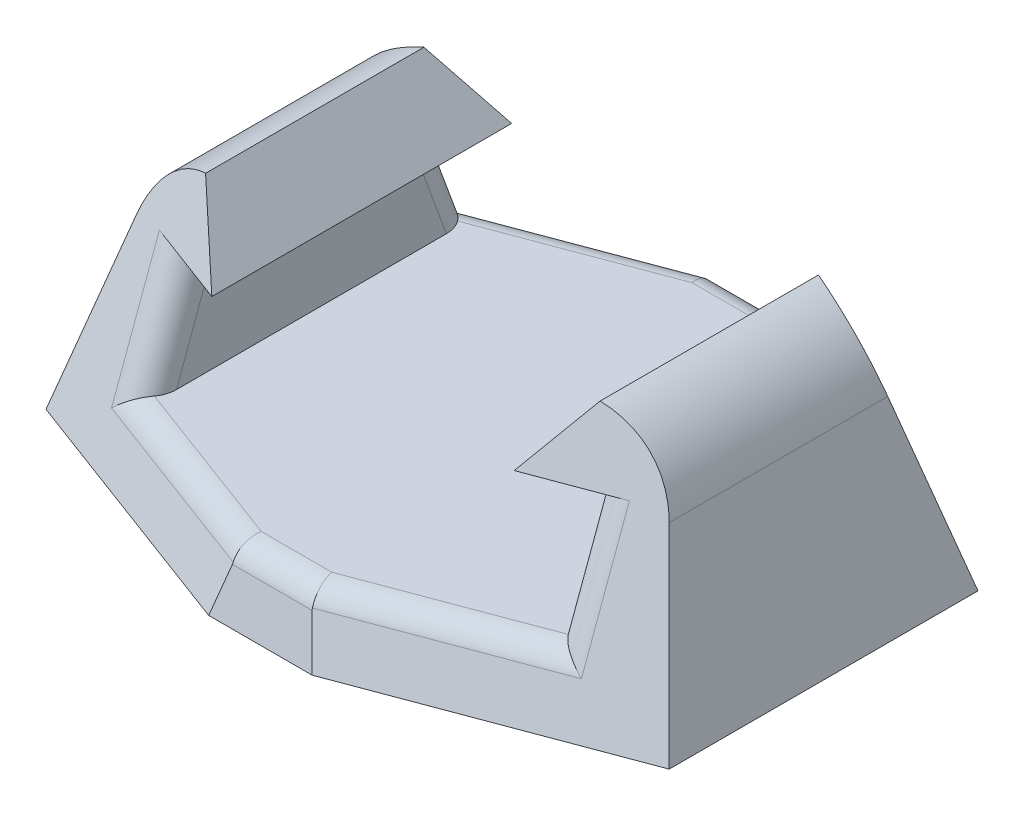
ISO-10303-21;
HEADER;
FILE_DESCRIPTION(('STEP AP214'),'2;1');
FILE_NAME('part.step','',(''),(''),'','','');
FILE_SCHEMA(('AUTOMOTIVE_DESIGN { 1 0 10303 214 1 1 1 1 }'));
ENDSEC;
DATA;
#1=APPLICATION_CONTEXT('core data for automotive mechanical design processes');
#2=APPLICATION_PROTOCOL_DEFINITION('international standard','automotive_design',2000,#1);
#3=PRODUCT_CONTEXT('',#1,'mechanical');
#4=PRODUCT('Part','Part','',(#3));
#5=PRODUCT_RELATED_PRODUCT_CATEGORY('part','',(#4));
#6=PRODUCT_DEFINITION_FORMATION('','',#4);
#7=PRODUCT_DEFINITION_CONTEXT('part definition',#1,'design');
#8=PRODUCT_DEFINITION('design','',#6,#7);
#9=PRODUCT_DEFINITION_SHAPE('','',#8);
#10=(LENGTH_UNIT() NAMED_UNIT(*) SI_UNIT(.MILLI.,.METRE.));
#11=(NAMED_UNIT(*) PLANE_ANGLE_UNIT() SI_UNIT($,.RADIAN.));
#12=(NAMED_UNIT(*) SI_UNIT($,.STERADIAN.) SOLID_ANGLE_UNIT());
#13=UNCERTAINTY_MEASURE_WITH_UNIT(LENGTH_MEASURE(1.E-05),#10,'distance_accuracy_value','');
#14=(GEOMETRIC_REPRESENTATION_CONTEXT(3) GLOBAL_UNCERTAINTY_ASSIGNED_CONTEXT((#13)) GLOBAL_UNIT_ASSIGNED_CONTEXT((#10,
#11,#12)) REPRESENTATION_CONTEXT('',''));
#15=CARTESIAN_POINT('',(0.,0.,0.));
#16=DIRECTION('',(0.,0.,1.));
#17=DIRECTION('',(1.,0.,0.));
#18=AXIS2_PLACEMENT_3D('',#15,#16,#17);
#19=CARTESIAN_POINT('',(-14.6095163514784,-3.32150879264574,20.));
#20=DIRECTION('',(0.965925826289067,-0.258819045102525,0.));
#21=DIRECTION('',(0.258819045102525,0.965925826289067,0.));
#22=AXIS2_PLACEMENT_3D('',#19,#20,#21);
#23=PLANE('',#22);
#24=DIRECTION('',(0.,0.,-1.));
#25=VECTOR('',#24,1.);
#26=CARTESIAN_POINT('',(-12.8161825284167,3.37130414995246,20.));
#27=LINE('',#26,#25);
#28=CARTESIAN_POINT('',(-12.8161825284167,3.37130414995246,14.344184387429));
#29=VERTEX_POINT('',#28);
#30=CARTESIAN_POINT('',(-12.8161825284167,3.37130414995246,5.65581561257101));
#31=VERTEX_POINT('',#30);
#32=EDGE_CURVE('E247',#29,#31,#27,.T.);
#33=ORIENTED_EDGE('',*,*,#32,.T.);
#34=DIRECTION('',(-0.250562807085736,-0.93511312653103,-0.250562807085725));
#35=VECTOR('',#34,1.);
#36=CARTESIAN_POINT('',(-13.5963751969371,0.459585471341505,4.87562294405061));
#37=LINE('',#36,#35);
#38=CARTESIAN_POINT('',(-14.6095163514784,-3.32150879264574,3.86248178950931));
#39=VERTEX_POINT('',#38);
#40=EDGE_CURVE('E292',#31,#39,#37,.T.);
#41=ORIENTED_EDGE('',*,*,#40,.T.);
#42=DIRECTION('',(0.,0.,-1.));
#43=VECTOR('',#42,1.);
#44=CARTESIAN_POINT('',(-14.6095163514784,-3.32150879264574,20.));
#45=LINE('',#44,#43);
#46=CARTESIAN_POINT('',(-14.6095163514784,-3.32150879264574,16.1375182104907));
#47=VERTEX_POINT('',#46);
#48=EDGE_CURVE('E253',#47,#39,#45,.T.);
#49=ORIENTED_EDGE('',*,*,#48,.F.);
#50=DIRECTION('',(0.250562807085736,0.93511312653103,-0.250562807085725));
#51=VECTOR('',#50,1.);
#52=CARTESIAN_POINT('',(-14.8520096028307,-4.22650592718497,16.380011461843));
#53=LINE('',#52,#51);
#54=EDGE_CURVE('E288',#47,#29,#53,.T.);
#55=ORIENTED_EDGE('',*,*,#54,.T.);
#56=EDGE_LOOP('',(#33,#41,#49,#55));
#57=FACE_BOUND('',#56,.T.);
#58=ADVANCED_FACE('F40',(#57),#23,.F.);
#59=CARTESIAN_POINT('',(10.1639913527597,-3.32150879264573,20.));
#60=DIRECTION('',(0.,1.,0.));
#61=DIRECTION('',(-1.,0.,0.));
#62=AXIS2_PLACEMENT_3D('',#59,#60,#61);
#63=PLANE('',#62);
#64=DIRECTION('',(1.,0.,0.));
#65=VECTOR('',#64,1.);
#66=CARTESIAN_POINT('',(10.1639913527597,-3.32150879264573,0.));
#67=LINE('',#66,#65);
#68=CARTESIAN_POINT('',(-4.28000862793321,-3.32150879264574,0.));
#69=VERTEX_POINT('',#68);
#70=CARTESIAN_POINT('',(-0.165516370785468,-3.32150879264574,0.));
#71=VERTEX_POINT('',#70);
#72=EDGE_CURVE('E433',#69,#71,#67,.T.);
#73=ORIENTED_EDGE('',*,*,#72,.T.);
#74=DIRECTION('',(-0.936659186885444,0.,-0.35024215569103));
#75=VECTOR('',#74,1.);
#76=CARTESIAN_POINT('',(8.29709706622276,-3.32150879264573,3.16439961776635));
#77=LINE('',#76,#75);
#78=CARTESIAN_POINT('',(10.1639913527597,-3.32150879264573,3.8624817895093));
#79=VERTEX_POINT('',#78);
#80=EDGE_CURVE('E285',#71,#79,#77,.F.);
#81=ORIENTED_EDGE('',*,*,#80,.T.);
#82=DIRECTION('',(0.,0.,-1.));
#83=VECTOR('',#82,1.);
#84=CARTESIAN_POINT('',(10.1639913527597,-3.32150879264573,20.));
#85=LINE('',#84,#83);
#86=CARTESIAN_POINT('',(10.1639913527597,-3.32150879264573,16.1375182104907));
#87=VERTEX_POINT('',#86);
#88=EDGE_CURVE('E240',#87,#79,#85,.T.);
#89=ORIENTED_EDGE('',*,*,#88,.F.);
#90=DIRECTION('',(0.936659186885443,0.,-0.35024215569103));
#91=VECTOR('',#90,1.);
#92=CARTESIAN_POINT('',(8.98678301720349,-3.32150879264573,16.577708186648));
#93=LINE('',#92,#91);
#94=CARTESIAN_POINT('',(-0.165516370785486,-3.32150879264574,20.));
#95=VERTEX_POINT('',#94);
#96=EDGE_CURVE('E276',#87,#95,#93,.F.);
#97=ORIENTED_EDGE('',*,*,#96,.T.);
#98=DIRECTION('',(1.,0.,0.));
#99=VECTOR('',#98,1.);
#100=CARTESIAN_POINT('',(10.1639913527597,-3.32150879264573,20.));
#101=LINE('',#100,#99);
#102=CARTESIAN_POINT('',(-4.2800086279332,-3.32150879264574,20.));
#103=VERTEX_POINT('',#102);
#104=EDGE_CURVE('E471',#103,#95,#101,.T.);
#105=ORIENTED_EDGE('',*,*,#104,.F.);
#106=DIRECTION('',(0.936659186885444,0.,0.35024215569103));
#107=VECTOR('',#106,1.);
#108=CARTESIAN_POINT('',(-14.7427113227856,-3.32150879264574,16.0877130150354));
#109=LINE('',#108,#107);
#110=EDGE_CURVE('E279',#103,#47,#109,.F.);
#111=ORIENTED_EDGE('',*,*,#110,.T.);
#112=ORIENTED_EDGE('',*,*,#48,.T.);
#113=DIRECTION('',(-0.936659186885444,0.,0.35024215569103));
#114=VECTOR('',#113,1.);
#115=CARTESIAN_POINT('',(-14.0530253718049,-3.32150879264574,3.65439478937901));
#116=LINE('',#115,#114);
#117=EDGE_CURVE('E282',#39,#69,#116,.F.);
#118=ORIENTED_EDGE('',*,*,#117,.T.);
#119=EDGE_LOOP('',(#73,#81,#89,#97,#105,#111,#112,#118));
#120=FACE_BOUND('',#119,.T.);
#121=ADVANCED_FACE('F517',(#120),#63,.F.);
#122=CARTESIAN_POINT('',(7.61847402466403,6.17849120735427,20.));
#123=DIRECTION('',(-0.965925826289067,-0.258819045102525,0.));
#124=DIRECTION('',(0.258819045102525,-0.965925826289067,0.));
#125=AXIS2_PLACEMENT_3D('',#122,#123,#124);
#126=PLANE('',#125);
#127=ORIENTED_EDGE('',*,*,#88,.T.);
#128=DIRECTION('',(-0.250562807085736,0.93511312653103,0.250562807085725));
#129=VECTOR('',#128,1.);
#130=CARTESIAN_POINT('',(6.76514482702044,9.36315912854207,7.26132831524845));
#131=LINE('',#130,#129);
#132=CARTESIAN_POINT('',(8.37065752969796,3.37130414995246,5.65581561257101));
#133=VERTEX_POINT('',#132);
#134=EDGE_CURVE('E221',#79,#133,#131,.T.);
#135=ORIENTED_EDGE('',*,*,#134,.T.);
#136=DIRECTION('',(0.,0.,1.));
#137=VECTOR('',#136,1.);
#138=CARTESIAN_POINT('',(8.37065752969796,3.37130414995246,20.));
#139=LINE('',#138,#137);
#140=CARTESIAN_POINT('',(8.37065752969796,3.37130414995246,14.344184387429));
#141=VERTEX_POINT('',#140);
#142=EDGE_CURVE('E237',#133,#141,#139,.T.);
#143=ORIENTED_EDGE('',*,*,#142,.T.);
#144=DIRECTION('',(0.250562807085736,-0.93511312653103,0.250562807085725));
#145=VECTOR('',#144,1.);
#146=CARTESIAN_POINT('',(8.02077923291406,4.67706773001559,13.9943060906451));
#147=LINE('',#146,#145);
#148=EDGE_CURVE('E242',#141,#87,#147,.T.);
#149=ORIENTED_EDGE('',*,*,#148,.T.);
#150=EDGE_LOOP('',(#127,#135,#143,#149));
#151=FACE_BOUND('',#150,.T.);
#152=ADVANCED_FACE('F235',(#151),#126,.F.);
#153=CARTESIAN_POINT('',(3.80446284792144,3.67849120735427,20.));
#154=DIRECTION('',(0.809377883181939,-0.587288210520119,0.));
#155=DIRECTION('',(0.587288210520119,0.809377883181939,0.));
#156=AXIS2_PLACEMENT_3D('',#153,#154,#155);
#157=PLANE('',#156);
#158=DIRECTION('',(0.,0.,-1.));
#159=VECTOR('',#158,1.);
#160=CARTESIAN_POINT('',(5.61847402466403,6.17849120735427,20.));
#161=LINE('',#160,#159);
#162=CARTESIAN_POINT('',(5.61847402466403,6.17849120735427,14.3398548736758));
#163=VERTEX_POINT('',#162);
#164=CARTESIAN_POINT('',(5.61847402466403,6.17849120735427,5.66014512632415));
#165=VERTEX_POINT('',#164);
#166=EDGE_CURVE('E508',#163,#165,#161,.T.);
#167=ORIENTED_EDGE('',*,*,#166,.T.);
#168=DIRECTION('',(0.521569914406186,0.718807470832079,0.459652743124974));
#169=VECTOR('',#168,1.);
#170=CARTESIAN_POINT('',(7.50823674265189,8.78288904984896,7.32556829047921));
#171=LINE('',#170,#169);
#172=CARTESIAN_POINT('',(3.80446284792144,3.67849120735427,4.06148080459386));
#173=VERTEX_POINT('',#172);
#174=EDGE_CURVE('E223',#165,#173,#171,.F.);
#175=ORIENTED_EDGE('',*,*,#174,.T.);
#176=DIRECTION('',(0.,0.,-1.));
#177=VECTOR('',#176,1.);
#178=CARTESIAN_POINT('',(3.80446284792144,3.67849120735427,20.));
#179=LINE('',#178,#177);
#180=CARTESIAN_POINT('',(3.80446284792144,3.67849120735427,15.9385191954061));
#181=VERTEX_POINT('',#180);
#182=EDGE_CURVE('E498',#181,#173,#179,.T.);
#183=ORIENTED_EDGE('',*,*,#182,.F.);
#184=DIRECTION('',(-0.521569914406186,-0.718807470832079,0.459652743124974));
#185=VECTOR('',#184,1.);
#186=CARTESIAN_POINT('',(5.79193156903858,6.41754368205571,14.1869890087452));
#187=LINE('',#186,#185);
#188=EDGE_CURVE('E229',#181,#163,#187,.F.);
#189=ORIENTED_EDGE('',*,*,#188,.T.);
#190=EDGE_LOOP('',(#167,#175,#183,#189));
#191=FACE_BOUND('',#190,.T.);
#192=ADVANCED_FACE('F588',(#191),#157,.F.);
#193=CARTESIAN_POINT('',(5.80446284792144,3.67849120735427,20.));
#194=DIRECTION('',(0.,1.,0.));
#195=DIRECTION('',(0.,0.,1.));
#196=AXIS2_PLACEMENT_3D('',#193,#194,#195);
#197=PLANE('',#196);
#198=ORIENTED_EDGE('',*,*,#182,.T.);
#199=DIRECTION('',(-0.936659186885444,0.,-0.35024215569103));
#200=VECTOR('',#199,1.);
#201=CARTESIAN_POINT('',(7.45169332833665,3.67849120735427,5.42527874054352));
#202=LINE('',#201,#200);
#203=CARTESIAN_POINT('',(7.13557266697512,3.67849120735427,5.30707269138075));
#204=VERTEX_POINT('',#203);
#205=EDGE_CURVE('E266',#173,#204,#202,.F.);
#206=ORIENTED_EDGE('',*,*,#205,.T.);
#207=CARTESIAN_POINT('',(6.80446284792144,3.67849120735427,6.31257591668668));
#208=DIRECTION('',(0.,1.,0.));
#209=DIRECTION('',(0.,0.,-1.));
#210=AXIS2_PLACEMENT_3D('',#207,#208,#209);
#211=ELLIPSE('',#210,1.06561202848115,1.);
#212=CARTESIAN_POINT('',(5.80446284792144,3.67849120735427,6.31257591668669));
#213=VERTEX_POINT('',#212);
#214=EDGE_CURVE('E405',#204,#213,#211,.T.);
#215=ORIENTED_EDGE('',*,*,#214,.T.);
#216=DIRECTION('',(0.,0.,-1.));
#217=VECTOR('',#216,1.);
#218=CARTESIAN_POINT('',(5.80446284792144,3.67849120735427,20.));
#219=LINE('',#218,#217);
#220=CARTESIAN_POINT('',(5.80446284792144,3.67849120735427,13.6874240833133));
#221=VERTEX_POINT('',#220);
#222=EDGE_CURVE('E493',#221,#213,#219,.T.);
#223=ORIENTED_EDGE('',*,*,#222,.F.);
#224=CARTESIAN_POINT('',(6.80446284792144,3.67849120735427,13.6874240833133));
#225=DIRECTION('',(0.,1.,0.));
#226=DIRECTION('',(0.,0.,-1.));
#227=AXIS2_PLACEMENT_3D('',#224,#225,#226);
#228=ELLIPSE('',#227,1.06561202848115,1.);
#229=CARTESIAN_POINT('',(7.13557266697512,3.67849120735427,14.6929273086192));
#230=VERTEX_POINT('',#229);
#231=EDGE_CURVE('E408',#221,#230,#228,.T.);
#232=ORIENTED_EDGE('',*,*,#231,.T.);
#233=DIRECTION('',(0.936659186885443,0.,-0.35024215569103));
#234=VECTOR('',#233,1.);
#235=CARTESIAN_POINT('',(8.14137927931738,3.67849120735427,14.3168290638709));
#236=LINE('',#235,#234);
#237=EDGE_CURVE('E263',#230,#181,#236,.F.);
#238=ORIENTED_EDGE('',*,*,#237,.T.);
#239=EDGE_LOOP('',(#198,#206,#215,#223,#232,#238));
#240=FACE_BOUND('',#239,.T.);
#241=ADVANCED_FACE('F584',(#240),#197,.F.);
#242=CARTESIAN_POINT('',(5.80446284792144,-0.821508792645734,20.));
#243=DIRECTION('',(1.,0.,0.));
#244=DIRECTION('',(0.,0.,-1.));
#245=AXIS2_PLACEMENT_3D('',#242,#243,#244);
#246=PLANE('',#245);
#247=ORIENTED_EDGE('',*,*,#222,.T.);
#248=DIRECTION('',(0.,0.938427845475182,0.345475294104814));
#249=VECTOR('',#248,1.);
#250=CARTESIAN_POINT('',(5.80446284792144,-1.30886502966497,4.47651748012437));
#251=LINE('',#250,#249);
#252=CARTESIAN_POINT('',(5.80446284792144,-0.821508792645734,4.6559340864515));
#253=VERTEX_POINT('',#252);
#254=EDGE_CURVE('E341',#213,#253,#251,.F.);
#255=ORIENTED_EDGE('',*,*,#254,.T.);
#256=DIRECTION('',(0.,0.,-1.));
#257=VECTOR('',#256,1.);
#258=CARTESIAN_POINT('',(5.80446284792144,-0.821508792645734,20.));
#259=LINE('',#258,#257);
#260=CARTESIAN_POINT('',(5.80446284792144,-0.821508792645734,15.3440659135485));
#261=VERTEX_POINT('',#260);
#262=EDGE_CURVE('E485',#261,#253,#259,.T.);
#263=ORIENTED_EDGE('',*,*,#262,.F.);
#264=DIRECTION('',(0.,-0.938427845475182,0.345475294104814));
#265=VECTOR('',#264,1.);
#266=CARTESIAN_POINT('',(5.80446284792144,3.19113497033503,13.8668406896404));
#267=LINE('',#266,#265);
#268=EDGE_CURVE('E337',#261,#221,#267,.F.);
#269=ORIENTED_EDGE('',*,*,#268,.T.);
#270=EDGE_LOOP('',(#247,#255,#263,#269));
#271=FACE_BOUND('',#270,.T.);
#272=ADVANCED_FACE('F489',(#271),#246,.F.);
#273=CARTESIAN_POINT('',(-10.1955371520786,-0.821508792645734,20.));
#274=DIRECTION('',(0.,-1.,0.));
#275=DIRECTION('',(0.,0.,-1.));
#276=AXIS2_PLACEMENT_3D('',#273,#274,#275);
#277=PLANE('',#276);
#278=CARTESIAN_POINT('',(-11.1955371520786,-0.821508792645734,15.3644264981764));
#279=DIRECTION('',(0.,-1.,0.));
#280=DIRECTION('',(0.,0.,1.));
#281=AXIS2_PLACEMENT_3D('',#278,#279,#280);
#282=ELLIPSE('',#281,1.06561202848115,1.);
#283=CARTESIAN_POINT('',(-10.1955371520786,-0.821508792645734,15.3644264981764));
#284=VERTEX_POINT('',#283);
#285=CARTESIAN_POINT('',(-10.4114273809065,-0.821508792645734,16.0257689381042));
#286=VERTEX_POINT('',#285);
#287=EDGE_CURVE('E50',#284,#286,#282,.T.);
#288=ORIENTED_EDGE('',*,*,#287,.T.);
#289=DIRECTION('',(-0.936659186885444,0.,-0.35024215569103));
#290=VECTOR('',#289,1.);
#291=CARTESIAN_POINT('',(-3.36042760379279,-0.821508792645734,18.6623281010213));
#292=LINE('',#291,#290);
#293=CARTESIAN_POINT('',(-3.62659739425575,-0.821508792645734,18.5628000309432));
#294=VERTEX_POINT('',#293);
#295=EDGE_CURVE('E58',#286,#294,#292,.F.);
#296=ORIENTED_EDGE('',*,*,#295,.T.);
#297=DIRECTION('',(1.,0.,0.));
#298=VECTOR('',#297,1.);
#299=CARTESIAN_POINT('',(-10.1955371520786,-0.821508792645734,18.5628000309432));
#300=LINE('',#299,#298);
#301=CARTESIAN_POINT('',(-0.818927604462946,-0.821508792645734,18.5628000309432));
#302=VERTEX_POINT('',#301);
#303=EDGE_CURVE('E383',#294,#302,#300,.T.);
#304=ORIENTED_EDGE('',*,*,#303,.T.);
#305=DIRECTION('',(-0.936659186885443,0.,0.35024215569103));
#306=VECTOR('',#305,1.);
#307=CARTESIAN_POINT('',(5.55475480485885,-0.821508792645734,16.1795081164596));
#308=LINE('',#307,#306);
#309=CARTESIAN_POINT('',(6.02035307674938,-0.821508792645734,16.0054083534763));
#310=VERTEX_POINT('',#309);
#311=EDGE_CURVE('E66',#302,#310,#308,.F.);
#312=ORIENTED_EDGE('',*,*,#311,.T.);
#313=CARTESIAN_POINT('',(6.80446284792144,-0.821508792645734,15.3440659135485));
#314=DIRECTION('',(0.,-1.,0.));
#315=DIRECTION('',(0.,0.,-1.));
#316=AXIS2_PLACEMENT_3D('',#313,#314,#315);
#317=ELLIPSE('',#316,1.06561202848115,1.);
#318=EDGE_CURVE('E412',#310,#261,#317,.T.);
#319=ORIENTED_EDGE('',*,*,#318,.T.);
#320=ORIENTED_EDGE('',*,*,#262,.T.);
#321=CARTESIAN_POINT('',(6.80446284792144,-0.821508792645734,4.6559340864515));
#322=DIRECTION('',(0.,-1.,0.));
#323=DIRECTION('',(0.,0.,-1.));
#324=AXIS2_PLACEMENT_3D('',#321,#322,#323);
#325=ELLIPSE('',#324,1.06561202848115,1.);
#326=CARTESIAN_POINT('',(6.02035307674938,-0.821508792645734,3.99459164652372));
#327=VERTEX_POINT('',#326);
#328=EDGE_CURVE('E401',#253,#327,#325,.T.);
#329=ORIENTED_EDGE('',*,*,#328,.T.);
#330=DIRECTION('',(0.936659186885444,0.,0.35024215569103));
#331=VECTOR('',#330,1.);
#332=CARTESIAN_POINT('',(-1.08509739492588,-0.821508792645734,1.33767189897871));
#333=LINE('',#332,#331);
#334=CARTESIAN_POINT('',(-0.818927604462917,-0.821508792645734,1.43719996905676));
#335=VERTEX_POINT('',#334);
#336=EDGE_CURVE('E372',#327,#335,#333,.F.);
#337=ORIENTED_EDGE('',*,*,#336,.T.);
#338=DIRECTION('',(-1.,0.,0.));
#339=VECTOR('',#338,1.);
#340=CARTESIAN_POINT('',(-10.1955371520786,-0.821508792645734,1.43719996905676));
#341=LINE('',#340,#339);
#342=CARTESIAN_POINT('',(-3.62659739425576,-0.821508792645734,1.43719996905676));
#343=VERTEX_POINT('',#342);
#344=EDGE_CURVE('E375',#335,#343,#341,.T.);
#345=ORIENTED_EDGE('',*,*,#344,.T.);
#346=DIRECTION('',(0.936659186885444,0.,-0.35024215569103));
#347=VECTOR('',#346,1.);
#348=CARTESIAN_POINT('',(-9.94582910901598,-0.821508792645734,3.80013129891241));
#349=LINE('',#348,#347);
#350=CARTESIAN_POINT('',(-10.4114273809065,-0.821508792645734,3.97423106189579));
#351=VERTEX_POINT('',#350);
#352=EDGE_CURVE('E378',#343,#351,#349,.F.);
#353=ORIENTED_EDGE('',*,*,#352,.T.);
#354=CARTESIAN_POINT('',(-11.1955371520786,-0.821508792645734,4.63557350182357));
#355=DIRECTION('',(0.,-1.,0.));
#356=DIRECTION('',(0.,0.,1.));
#357=AXIS2_PLACEMENT_3D('',#354,#355,#356);
#358=ELLIPSE('',#357,1.06561202848115,1.);
#359=CARTESIAN_POINT('',(-10.1955371520786,-0.821508792645734,4.63557350182357));
#360=VERTEX_POINT('',#359);
#361=EDGE_CURVE('E398',#351,#360,#358,.T.);
#362=ORIENTED_EDGE('',*,*,#361,.T.);
#363=DIRECTION('',(0.,0.,-1.));
#364=VECTOR('',#363,1.);
#365=CARTESIAN_POINT('',(-10.1955371520786,-0.821508792645734,20.));
#366=LINE('',#365,#364);
#367=EDGE_CURVE('E494',#284,#360,#366,.T.);
#368=ORIENTED_EDGE('',*,*,#367,.F.);
#369=EDGE_LOOP('',(#288,#296,#304,#312,#319,#320,#329,#337,#345,#353,#362,#368));
#370=FACE_BOUND('',#369,.T.);
#371=ADVANCED_FACE('F484',(#370),#277,.F.);
#372=CARTESIAN_POINT('',(-10.1955371520786,3.67849120735427,20.));
#373=DIRECTION('',(-1.,0.,0.));
#374=DIRECTION('',(0.,-1.,0.));
#375=AXIS2_PLACEMENT_3D('',#372,#373,#374);
#376=PLANE('',#375);
#377=ORIENTED_EDGE('',*,*,#367,.T.);
#378=DIRECTION('',(0.,-0.938427845475182,-0.345475294104814));
#379=VECTOR('',#378,1.);
#380=CARTESIAN_POINT('',(-10.1955371520786,3.19113497033503,6.11279872573163));
#381=LINE('',#380,#379);
#382=CARTESIAN_POINT('',(-10.1955371520786,3.67849120735427,6.29221533205876));
#383=VERTEX_POINT('',#382);
#384=EDGE_CURVE('E324',#360,#383,#381,.F.);
#385=ORIENTED_EDGE('',*,*,#384,.T.);
#386=DIRECTION('',(0.,0.,-1.));
#387=VECTOR('',#386,1.);
#388=CARTESIAN_POINT('',(-10.1955371520786,3.67849120735427,20.));
#389=LINE('',#388,#387);
#390=CARTESIAN_POINT('',(-10.1955371520786,3.67849120735427,13.7077846679412));
#391=VERTEX_POINT('',#390);
#392=EDGE_CURVE('E501',#391,#383,#389,.T.);
#393=ORIENTED_EDGE('',*,*,#392,.F.);
#394=DIRECTION('',(0.,0.938427845475182,-0.345475294104814));
#395=VECTOR('',#394,1.);
#396=CARTESIAN_POINT('',(-10.1955371520786,-1.30886502966497,15.5438431045036));
#397=LINE('',#396,#395);
#398=EDGE_CURVE('E321',#391,#284,#397,.F.);
#399=ORIENTED_EDGE('',*,*,#398,.T.);
#400=EDGE_LOOP('',(#377,#385,#393,#399));
#401=FACE_BOUND('',#400,.T.);
#402=ADVANCED_FACE('F549',(#401),#376,.F.);
#403=CARTESIAN_POINT('',(-8.19553715207856,3.67849120735427,20.));
#404=DIRECTION('',(0.,1.,0.));
#405=DIRECTION('',(-1.,0.,0.));
#406=AXIS2_PLACEMENT_3D('',#403,#404,#405);
#407=PLANE('',#406);
#408=DIRECTION('',(0.936659186885444,0.,0.35024215569103));
#409=VECTOR('',#408,1.);
#410=CARTESIAN_POINT('',(-13.8973075848995,3.67849120735426,13.8268338922582));
#411=LINE('',#410,#409);
#412=CARTESIAN_POINT('',(-8.19553715207856,3.67849120735427,15.9588797800341));
#413=VERTEX_POINT('',#412);
#414=CARTESIAN_POINT('',(-11.5266469711322,3.67849120735426,14.7132878932472));
#415=VERTEX_POINT('',#414);
#416=EDGE_CURVE('E296',#413,#415,#411,.F.);
#417=ORIENTED_EDGE('',*,*,#416,.T.);
#418=CARTESIAN_POINT('',(-11.1955371520786,3.67849120735427,13.7077846679412));
#419=DIRECTION('',(0.,1.,0.));
#420=DIRECTION('',(0.,0.,1.));
#421=AXIS2_PLACEMENT_3D('',#418,#419,#420);
#422=ELLIPSE('',#421,1.06561202848115,1.);
#423=EDGE_CURVE('E11',#415,#391,#422,.T.);
#424=ORIENTED_EDGE('',*,*,#423,.T.);
#425=ORIENTED_EDGE('',*,*,#392,.T.);
#426=CARTESIAN_POINT('',(-11.1955371520786,3.67849120735427,6.29221533205876));
#427=DIRECTION('',(0.,1.,0.));
#428=DIRECTION('',(0.,0.,1.));
#429=AXIS2_PLACEMENT_3D('',#426,#427,#428);
#430=ELLIPSE('',#429,1.06561202848115,1.);
#431=CARTESIAN_POINT('',(-11.5266469711322,3.67849120735427,5.28671210675282));
#432=VERTEX_POINT('',#431);
#433=EDGE_CURVE('E394',#383,#432,#430,.T.);
#434=ORIENTED_EDGE('',*,*,#433,.T.);
#435=DIRECTION('',(-0.936659186885444,0.,0.35024215569103));
#436=VECTOR('',#435,1.);
#437=CARTESIAN_POINT('',(-13.2076216339188,3.67849120735426,5.91527391215617));
#438=LINE('',#437,#436);
#439=CARTESIAN_POINT('',(-8.19553715207856,3.67849120735427,4.04112021996592));
#440=VERTEX_POINT('',#439);
#441=EDGE_CURVE('E299',#432,#440,#438,.F.);
#442=ORIENTED_EDGE('',*,*,#441,.T.);
#443=DIRECTION('',(0.,0.,-1.));
#444=VECTOR('',#443,1.);
#445=CARTESIAN_POINT('',(-8.19553715207856,3.67849120735427,20.));
#446=LINE('',#445,#444);
#447=EDGE_CURVE('E535',#413,#440,#446,.T.);
#448=ORIENTED_EDGE('',*,*,#447,.F.);
#449=EDGE_LOOP('',(#417,#424,#425,#434,#442,#448));
#450=FACE_BOUND('',#449,.T.);
#451=ADVANCED_FACE('F546',(#450),#407,.F.);
#452=CARTESIAN_POINT('',(-10.0639990233827,6.17849120735427,20.));
#453=DIRECTION('',(-0.801004393997645,-0.598658467572677,0.));
#454=DIRECTION('',(0.598658467572677,-0.801004393997645,0.));
#455=AXIS2_PLACEMENT_3D('',#452,#453,#454);
#456=PLANE('',#455);
#457=ORIENTED_EDGE('',*,*,#447,.T.);
#458=DIRECTION('',(0.531414004022172,-0.71103137316264,-0.460471000940964));
#459=VECTOR('',#458,1.);
#460=CARTESIAN_POINT('',(-8.70867174170687,4.36506474346575,4.4857520819703));
#461=LINE('',#460,#459);
#462=CARTESIAN_POINT('',(-10.0639990233827,6.17849120735427,5.66014512632416));
#463=VERTEX_POINT('',#462);
#464=EDGE_CURVE('E305',#440,#463,#461,.F.);
#465=ORIENTED_EDGE('',*,*,#464,.T.);
#466=DIRECTION('',(0.,0.,-1.));
#467=VECTOR('',#466,1.);
#468=CARTESIAN_POINT('',(-10.0639990233827,6.17849120735427,20.));
#469=LINE('',#468,#467);
#470=CARTESIAN_POINT('',(-10.0639990233827,6.17849120735427,14.3398548736758));
#471=VERTEX_POINT('',#470);
#472=EDGE_CURVE('E527',#471,#463,#469,.T.);
#473=ORIENTED_EDGE('',*,*,#472,.F.);
#474=DIRECTION('',(-0.531414004022172,0.71103137316264,-0.460471000940964));
#475=VECTOR('',#474,1.);
#476=CARTESIAN_POINT('',(-6.98536014805635,2.05927566085568,17.0074998994515));
#477=LINE('',#476,#475);
#478=EDGE_CURVE('E302',#471,#413,#477,.F.);
#479=ORIENTED_EDGE('',*,*,#478,.T.);
#480=EDGE_LOOP('',(#457,#465,#473,#479));
#481=FACE_BOUND('',#480,.T.);
#482=ADVANCED_FACE('F531',(#481),#456,.F.);
#483=CARTESIAN_POINT('',(-14.6095163514784,6.17849120735427,2.5455173280956));
#484=DIRECTION('',(0.,-0.258819045102515,0.96592582628907));
#485=DIRECTION('',(0.,-0.96592582628907,-0.258819045102515));
#486=AXIS2_PLACEMENT_3D('',#483,#484,#485);
#487=PLANE('',#486);
#488=DIRECTION('',(0.250562807085736,0.93511312653103,0.250562807085725));
#489=VECTOR('',#488,1.);
#490=CARTESIAN_POINT('',(-2.54280752141667,3.16181399983877,1.73720110651647));
#491=LINE('',#490,#489);
#492=CARTESIAN_POINT('',(-3.80873448516551,-1.56268974754322,0.471274142767685));
#493=VERTEX_POINT('',#492);
#494=EDGE_CURVE('E269',#69,#493,#491,.T.);
#495=ORIENTED_EDGE('',*,*,#494,.T.);
#496=DIRECTION('',(-1.,0.,0.));
#497=VECTOR('',#496,1.);
#498=CARTESIAN_POINT('',(-14.6095163514784,-1.56268974754322,0.471274142767685));
#499=LINE('',#498,#497);
#500=CARTESIAN_POINT('',(-0.636790513553177,-1.56268974754322,0.471274142767685));
#501=VERTEX_POINT('',#500);
#502=EDGE_CURVE('E391',#493,#501,#499,.F.);
#503=ORIENTED_EDGE('',*,*,#502,.T.);
#504=DIRECTION('',(0.250562807085736,-0.93511312653103,-0.250562807085725));
#505=VECTOR('',#504,1.);
#506=CARTESIAN_POINT('',(-3.45804090870769,8.96636006804702,3.29252453792208));
#507=LINE('',#506,#505);
#508=EDGE_CURVE('E273',#501,#71,#507,.T.);
#509=ORIENTED_EDGE('',*,*,#508,.T.);
#510=ORIENTED_EDGE('',*,*,#72,.F.);
#511=EDGE_LOOP('',(#495,#503,#509,#510));
#512=FACE_BOUND('',#511,.T.);
#513=ADVANCED_FACE('F571',(#512),#487,.F.);
#514=CARTESIAN_POINT('',(-14.6095163514784,-3.32150879264573,20.));
#515=DIRECTION('',(0.,-0.258819045102514,-0.96592582628907));
#516=DIRECTION('',(0.,0.96592582628907,-0.258819045102514));
#517=AXIS2_PLACEMENT_3D('',#514,#515,#516);
#518=PLANE('',#517);
#519=DIRECTION('',(-0.250562807085736,0.93511312653103,-0.250562807085725));
#520=VECTOR('',#519,1.);
#521=CARTESIAN_POINT('',(-1.07233553750977,0.0627864108465031,19.0931808332758));
#522=LINE('',#521,#520);
#523=CARTESIAN_POINT('',(-0.636790513553192,-1.56268974754322,19.5287258572323));
#524=VERTEX_POINT('',#523);
#525=EDGE_CURVE('E314',#95,#524,#522,.T.);
#526=ORIENTED_EDGE('',*,*,#525,.T.);
#527=DIRECTION('',(1.,0.,0.));
#528=VECTOR('',#527,1.);
#529=CARTESIAN_POINT('',(-14.6095163514784,-1.56268974754322,19.5287258572323));
#530=LINE('',#529,#528);
#531=CARTESIAN_POINT('',(-3.80873448516549,-1.56268974754322,19.5287258572323));
#532=VERTEX_POINT('',#531);
#533=EDGE_CURVE('E388',#524,#532,#530,.F.);
#534=ORIENTED_EDGE('',*,*,#533,.T.);
#535=DIRECTION('',(-0.250562807085736,-0.93511312653103,0.250562807085725));
#536=VECTOR('',#535,1.);
#537=CARTESIAN_POINT('',(-4.92851289261459,-5.74175965736174,20.6485042646814));
#538=LINE('',#537,#536);
#539=EDGE_CURVE('E318',#532,#103,#538,.T.);
#540=ORIENTED_EDGE('',*,*,#539,.T.);
#541=ORIENTED_EDGE('',*,*,#104,.T.);
#542=EDGE_LOOP('',(#526,#534,#540,#541));
#543=FACE_BOUND('',#542,.T.);
#544=ADVANCED_FACE('F467',(#543),#518,.F.);
#545=CARTESIAN_POINT('',(-8.95247922326038,2.33602796954236,20.));
#546=DIRECTION('',(0.,0.,-1.));
#547=DIRECTION('',(-1.,0.,0.));
#548=AXIS2_PLACEMENT_3D('',#545,#546,#547);
#549=CYLINDRICAL_SURFACE('',#548,4.);
#550=ORIENTED_EDGE('',*,*,#472,.T.);
#551=CARTESIAN_POINT('',(-8.95247922326038,2.33602796954236,3.82994334889182));
#552=DIRECTION('',(0.331109819053685,-0.325987801565111,0.885493219035009));
#553=DIRECTION('',(0.630999782217028,-0.62123869470522,-0.464652299082893));
#554=AXIS2_PLACEMENT_3D('',#551,#552,#553);
#555=ELLIPSE('',#554,4.51725650068683,4.);
#556=EDGE_CURVE('E311',#463,#31,#555,.T.);
#557=ORIENTED_EDGE('',*,*,#556,.T.);
#558=ORIENTED_EDGE('',*,*,#32,.F.);
#559=CARTESIAN_POINT('',(-8.95247922326038,2.33602796954236,16.1700566511082));
#560=DIRECTION('',(0.331109819053685,-0.325987801565111,-0.885493219035009));
#561=DIRECTION('',(-0.630999782217028,0.62123869470522,-0.464652299082893));
#562=AXIS2_PLACEMENT_3D('',#559,#560,#561);
#563=ELLIPSE('',#562,4.51725650068683,4.);
#564=EDGE_CURVE('E308',#29,#471,#563,.T.);
#565=ORIENTED_EDGE('',*,*,#564,.T.);
#566=EDGE_LOOP('',(#550,#557,#558,#565));
#567=FACE_BOUND('',#566,.T.);
#568=ADVANCED_FACE('F526',(#567),#549,.T.);
#569=CARTESIAN_POINT('',(4.50695422454169,2.33602796954236,20.));
#570=DIRECTION('',(0.,0.,1.));
#571=DIRECTION('',(1.,0.,0.));
#572=AXIS2_PLACEMENT_3D('',#569,#570,#571);
#573=CYLINDRICAL_SURFACE('',#572,4.);
#574=ORIENTED_EDGE('',*,*,#142,.F.);
#575=CARTESIAN_POINT('',(4.50695422454169,2.33602796954236,3.82994334889181));
#576=DIRECTION('',(-0.331109819053685,-0.325987801565111,0.885493219035009));
#577=DIRECTION('',(0.630999782217028,0.62123869470522,0.464652299082893));
#578=AXIS2_PLACEMENT_3D('',#575,#576,#577);
#579=ELLIPSE('',#578,4.51725650068683,4.);
#580=EDGE_CURVE('E216',#133,#165,#579,.T.);
#581=ORIENTED_EDGE('',*,*,#580,.T.);
#582=ORIENTED_EDGE('',*,*,#166,.F.);
#583=CARTESIAN_POINT('',(4.50695422454169,2.33602796954236,16.1700566511082));
#584=DIRECTION('',(-0.331109819053685,-0.325987801565111,-0.885493219035009));
#585=DIRECTION('',(-0.630999782217028,-0.62123869470522,0.464652299082893));
#586=AXIS2_PLACEMENT_3D('',#583,#584,#585);
#587=ELLIPSE('',#586,4.51725650068683,4.);
#588=EDGE_CURVE('E230',#163,#141,#587,.T.);
#589=ORIENTED_EDGE('',*,*,#588,.T.);
#590=EDGE_LOOP('',(#574,#581,#582,#589));
#591=FACE_BOUND('',#590,.T.);
#592=ADVANCED_FACE('F244',(#591),#573,.T.);
#593=CARTESIAN_POINT('',(6.76514482702044,9.36315912854207,7.26132831524845));
#594=DIRECTION('',(-0.331109819053685,-0.325987801565111,0.885493219035009));
#595=DIRECTION('',(-0.250562807085736,0.93511312653103,0.250562807085725));
#596=AXIS2_PLACEMENT_3D('',#593,#594,#595);
#597=PLANE('',#596);
#598=DIRECTION('',(0.,-0.938427845475182,-0.345475294104814));
#599=VECTOR('',#598,1.);
#600=CARTESIAN_POINT('',(7.13557266697512,3.51712277190015,5.24766609132455));
#601=LINE('',#600,#599);
#602=CARTESIAN_POINT('',(7.13557266697512,-1.49552099108062,3.40229823847534));
#603=VERTEX_POINT('',#602);
#604=EDGE_CURVE('E350',#603,#204,#601,.F.);
#605=ORIENTED_EDGE('',*,*,#604,.T.);
#606=ORIENTED_EDGE('',*,*,#205,.F.);
#607=ORIENTED_EDGE('',*,*,#174,.F.);
#608=ORIENTED_EDGE('',*,*,#580,.F.);
#609=ORIENTED_EDGE('',*,*,#134,.F.);
#610=ORIENTED_EDGE('',*,*,#80,.F.);
#611=ORIENTED_EDGE('',*,*,#508,.F.);
#612=CARTESIAN_POINT('',(2.20121840889908,-1.82150879264573,1.43719996905676));
#613=DIRECTION('',(-0.331109819053685,-0.325987801565111,0.885493219035009));
#614=DIRECTION('',(-0.943592225342195,0.114390262118564,-0.310722674110227));
#615=AXIS2_PLACEMENT_3D('',#612,#613,#614);
#616=ELLIPSE('',#615,3.020146013362,1.);
#617=CARTESIAN_POINT('',(-0.647958018644298,-1.49552099108062,0.491825993727013));
#618=VERTEX_POINT('',#617);
#619=EDGE_CURVE('E347',#501,#618,#616,.F.);
#620=ORIENTED_EDGE('',*,*,#619,.T.);
#621=DIRECTION('',(-0.936659186885444,0.,-0.35024215569103));
#622=VECTOR('',#621,1.);
#623=CARTESIAN_POINT('',(5.88586462391253,-1.49552099108062,2.93499866450534));
#624=LINE('',#623,#622);
#625=EDGE_CURVE('E344',#618,#603,#624,.F.);
#626=ORIENTED_EDGE('',*,*,#625,.T.);
#627=EDGE_LOOP('',(#605,#606,#607,#608,#609,#610,#611,#620,#626));
#628=FACE_BOUND('',#627,.T.);
#629=ADVANCED_FACE('F219',(#628),#597,.F.);
#630=CARTESIAN_POINT('',(-13.5963751969371,0.459585471341503,4.87562294405061));
#631=DIRECTION('',(0.331109819053685,-0.325987801565111,0.885493219035009));
#632=DIRECTION('',(-0.250562807085736,-0.93511312653103,-0.250562807085725));
#633=AXIS2_PLACEMENT_3D('',#630,#631,#632);
#634=PLANE('',#633);
#635=ORIENTED_EDGE('',*,*,#441,.F.);
#636=DIRECTION('',(0.,0.938427845475182,0.345475294104814));
#637=VECTOR('',#636,1.);
#638=CARTESIAN_POINT('',(-11.5266469711323,-0.982877228099858,3.57066367646144));
#639=LINE('',#638,#637);
#640=CARTESIAN_POINT('',(-11.5266469711323,-1.49552099108062,3.38193765384741));
#641=VERTEX_POINT('',#640);
#642=EDGE_CURVE('E334',#432,#641,#639,.F.);
#643=ORIENTED_EDGE('',*,*,#642,.T.);
#644=DIRECTION('',(-0.936659186885444,0.,0.35024215569103));
#645=VECTOR('',#644,1.);
#646=CARTESIAN_POINT('',(-3.69153742284649,-1.49552099108062,0.452178679943705));
#647=LINE('',#646,#645);
#648=CARTESIAN_POINT('',(-3.79756698007439,-1.49552099108062,0.491825993727013));
#649=VERTEX_POINT('',#648);
#650=EDGE_CURVE('E331',#641,#649,#647,.F.);
#651=ORIENTED_EDGE('',*,*,#650,.T.);
#652=CARTESIAN_POINT('',(-6.64674340761776,-1.82150879264573,1.43719996905676));
#653=DIRECTION('',(0.331109819053685,-0.325987801565111,0.885493219035009));
#654=DIRECTION('',(-0.943592225342195,-0.114390262118564,0.310722674110227));
#655=AXIS2_PLACEMENT_3D('',#652,#653,#654);
#656=ELLIPSE('',#655,3.020146013362,1.);
#657=EDGE_CURVE('E328',#649,#493,#656,.F.);
#658=ORIENTED_EDGE('',*,*,#657,.T.);
#659=ORIENTED_EDGE('',*,*,#494,.F.);
#660=ORIENTED_EDGE('',*,*,#117,.F.);
#661=ORIENTED_EDGE('',*,*,#40,.F.);
#662=ORIENTED_EDGE('',*,*,#556,.F.);
#663=ORIENTED_EDGE('',*,*,#464,.F.);
#664=EDGE_LOOP('',(#635,#643,#651,#658,#659,#660,#661,#662,#663));
#665=FACE_BOUND('',#664,.T.);
#666=ADVANCED_FACE('F558',(#665),#634,.F.);
#667=CARTESIAN_POINT('',(-14.8520096028307,-4.22650592718497,16.380011461843));
#668=DIRECTION('',(0.331109819053685,-0.325987801565111,-0.885493219035009));
#669=DIRECTION('',(0.250562807085736,0.93511312653103,-0.250562807085725));
#670=AXIS2_PLACEMENT_3D('',#667,#668,#669);
#671=PLANE('',#670);
#672=DIRECTION('',(0.,-0.938427845475182,0.345475294104814));
#673=VECTOR('',#672,1.);
#674=CARTESIAN_POINT('',(-11.5266469711322,3.51712277190014,14.7726944933034));
#675=LINE('',#674,#673);
#676=CARTESIAN_POINT('',(-11.5266469711322,-1.49552099108062,16.6180623461526));
#677=VERTEX_POINT('',#676);
#678=EDGE_CURVE('E368',#677,#415,#675,.F.);
#679=ORIENTED_EDGE('',*,*,#678,.T.);
#680=ORIENTED_EDGE('',*,*,#416,.F.);
#681=ORIENTED_EDGE('',*,*,#478,.F.);
#682=ORIENTED_EDGE('',*,*,#564,.F.);
#683=ORIENTED_EDGE('',*,*,#54,.F.);
#684=ORIENTED_EDGE('',*,*,#110,.F.);
#685=ORIENTED_EDGE('',*,*,#539,.F.);
#686=CARTESIAN_POINT('',(-6.64674340761775,-1.82150879264573,18.5628000309432));
#687=DIRECTION('',(0.331109819053685,-0.325987801565111,-0.885493219035009));
#688=DIRECTION('',(0.943592225342195,0.114390262118564,0.310722674110227));
#689=AXIS2_PLACEMENT_3D('',#686,#687,#688);
#690=ELLIPSE('',#689,3.020146013362,1.);
#691=CARTESIAN_POINT('',(-3.79756698007438,-1.49552099108062,19.508174006273));
#692=VERTEX_POINT('',#691);
#693=EDGE_CURVE('E362',#532,#692,#690,.F.);
#694=ORIENTED_EDGE('',*,*,#693,.T.);
#695=DIRECTION('',(0.936659186885444,0.,0.35024215569103));
#696=VECTOR('',#695,1.);
#697=CARTESIAN_POINT('',(-10.2769389280697,-1.49552099108062,17.0853619201226));
#698=LINE('',#697,#696);
#699=EDGE_CURVE('E365',#692,#677,#698,.F.);
#700=ORIENTED_EDGE('',*,*,#699,.T.);
#701=EDGE_LOOP('',(#679,#680,#681,#682,#683,#684,#685,#694,#700));
#702=FACE_BOUND('',#701,.T.);
#703=ADVANCED_FACE('F458',(#702),#671,.F.);
#704=CARTESIAN_POINT('',(8.02077923291406,4.67706773001559,13.9943060906451));
#705=DIRECTION('',(-0.331109819053685,-0.325987801565111,-0.885493219035009));
#706=DIRECTION('',(0.250562807085736,-0.93511312653103,0.250562807085725));
#707=AXIS2_PLACEMENT_3D('',#704,#705,#706);
#708=PLANE('',#707);
#709=ORIENTED_EDGE('',*,*,#237,.F.);
#710=DIRECTION('',(0.,0.938427845475182,-0.345475294104814));
#711=VECTOR('',#710,1.);
#712=CARTESIAN_POINT('',(7.13557266697512,-0.982877228099858,16.4089757389106));
#713=LINE('',#712,#711);
#714=CARTESIAN_POINT('',(7.13557266697512,-1.49552099108062,16.5977017615246));
#715=VERTEX_POINT('',#714);
#716=EDGE_CURVE('E359',#230,#715,#713,.F.);
#717=ORIENTED_EDGE('',*,*,#716,.T.);
#718=DIRECTION('',(0.936659186885444,0.,-0.35024215569103));
#719=VECTOR('',#718,1.);
#720=CARTESIAN_POINT('',(-0.753987575872207,-1.49552099108062,19.5478213200563));
#721=LINE('',#720,#719);
#722=CARTESIAN_POINT('',(-0.647958018644311,-1.49552099108062,19.508174006273));
#723=VERTEX_POINT('',#722);
#724=EDGE_CURVE('E353',#715,#723,#721,.F.);
#725=ORIENTED_EDGE('',*,*,#724,.T.);
#726=CARTESIAN_POINT('',(2.20121840889907,-1.82150879264573,18.5628000309432));
#727=DIRECTION('',(-0.331109819053685,-0.325987801565111,-0.885493219035009));
#728=DIRECTION('',(0.943592225342195,-0.114390262118564,-0.310722674110227));
#729=AXIS2_PLACEMENT_3D('',#726,#727,#728);
#730=ELLIPSE('',#729,3.020146013362,1.);
#731=EDGE_CURVE('E356',#723,#524,#730,.F.);
#732=ORIENTED_EDGE('',*,*,#731,.T.);
#733=ORIENTED_EDGE('',*,*,#525,.F.);
#734=ORIENTED_EDGE('',*,*,#96,.F.);
#735=ORIENTED_EDGE('',*,*,#148,.F.);
#736=ORIENTED_EDGE('',*,*,#588,.F.);
#737=ORIENTED_EDGE('',*,*,#188,.F.);
#738=EDGE_LOOP('',(#709,#717,#725,#732,#733,#734,#735,#736,#737));
#739=FACE_BOUND('',#738,.T.);
#740=ADVANCED_FACE('F473',(#739),#708,.F.);
#741=CARTESIAN_POINT('',(6.80446284792144,4.15309316619525,6.48729712951503));
#742=DIRECTION('',(0.,-0.938427845475182,-0.345475294104814));
#743=DIRECTION('',(0.,0.345475294104814,-0.938427845475182));
#744=AXIS2_PLACEMENT_3D('',#741,#742,#743);
#745=CYLINDRICAL_SURFACE('',#744,1.);
#746=ORIENTED_EDGE('',*,*,#214,.F.);
#747=ORIENTED_EDGE('',*,*,#604,.F.);
#748=CARTESIAN_POINT('',(6.80446284792144,-1.82150879264573,4.28779145751035));
#749=DIRECTION('',(-0.625552538342614,-0.626733745857325,-0.464638390123715));
#750=DIRECTION('',(0.706434929416255,-0.707768864131781,0.00359520044787325));
#751=AXIS2_PLACEMENT_3D('',#748,#749,#750);
#752=ELLIPSE('',#751,1.33571003648122,1.);
#753=EDGE_CURVE('E429',#327,#603,#752,.T.);
#754=ORIENTED_EDGE('',*,*,#753,.F.);
#755=ORIENTED_EDGE('',*,*,#328,.F.);
#756=ORIENTED_EDGE('',*,*,#254,.F.);
#757=EDGE_LOOP('',(#746,#747,#754,#755,#756));
#758=FACE_BOUND('',#757,.T.);
#759=ADVANCED_FACE('F582',(#758),#745,.T.);
#760=CARTESIAN_POINT('',(-2.95564613378582,-1.82150879264573,0.638223228857922));
#761=DIRECTION('',(-0.936659186885444,0.,-0.35024215569103));
#762=DIRECTION('',(-0.35024215569103,0.,0.936659186885444));
#763=AXIS2_PLACEMENT_3D('',#760,#761,#762);
#764=CYLINDRICAL_SURFACE('',#763,1.);
#765=ORIENTED_EDGE('',*,*,#753,.T.);
#766=ORIENTED_EDGE('',*,*,#625,.F.);
#767=CARTESIAN_POINT('',(-0.818927604462916,-1.82150879264573,1.43719996905676));
#768=DIRECTION('',(-0.984037394331497,0.,-0.177961812075732));
#769=DIRECTION('',(0.177961812075732,0.,-0.984037394331497));
#770=AXIS2_PLACEMENT_3D('',#767,#768,#769);
#771=ELLIPSE('',#770,1.01622154377512,1.);
#772=EDGE_CURVE('E425',#335,#618,#771,.T.);
#773=ORIENTED_EDGE('',*,*,#772,.F.);
#774=ORIENTED_EDGE('',*,*,#336,.F.);
#775=EDGE_LOOP('',(#765,#766,#773,#774));
#776=FACE_BOUND('',#775,.T.);
#777=ADVANCED_FACE('F577',(#776),#764,.T.);
#778=CARTESIAN_POINT('',(-10.1955371520786,-1.82150879264573,1.43719996905676));
#779=DIRECTION('',(-1.,0.,0.));
#780=DIRECTION('',(0.,0.,1.));
#781=AXIS2_PLACEMENT_3D('',#778,#779,#780);
#782=CYLINDRICAL_SURFACE('',#781,1.);
#783=ORIENTED_EDGE('',*,*,#502,.F.);
#784=ORIENTED_EDGE('',*,*,#657,.F.);
#785=CARTESIAN_POINT('',(-3.62659739425575,-1.82150879264573,1.43719996905675));
#786=DIRECTION('',(-0.984037394331497,0.,0.177961812075732));
#787=DIRECTION('',(-0.177961812075732,0.,-0.984037394331497));
#788=AXIS2_PLACEMENT_3D('',#785,#786,#787);
#789=ELLIPSE('',#788,1.01622154377512,1.);
#790=EDGE_CURVE('E421',#343,#649,#789,.T.);
#791=ORIENTED_EDGE('',*,*,#790,.F.);
#792=ORIENTED_EDGE('',*,*,#344,.F.);
#793=ORIENTED_EDGE('',*,*,#772,.T.);
#794=ORIENTED_EDGE('',*,*,#619,.F.);
#795=EDGE_LOOP('',(#783,#784,#791,#792,#793,#794));
#796=FACE_BOUND('',#795,.T.);
#797=ADVANCED_FACE('F567',(#796),#782,.T.);
#798=CARTESIAN_POINT('',(-15.4793945315604,-1.82150879264573,5.86928079254389));
#799=DIRECTION('',(-0.936659186885444,0.,0.35024215569103));
#800=DIRECTION('',(0.35024215569103,0.,0.936659186885444));
#801=AXIS2_PLACEMENT_3D('',#798,#799,#800);
#802=CYLINDRICAL_SURFACE('',#801,1.);
#803=ORIENTED_EDGE('',*,*,#790,.T.);
#804=ORIENTED_EDGE('',*,*,#650,.F.);
#805=CARTESIAN_POINT('',(-11.1955371520786,-1.82150879264573,4.26743087288242));
#806=DIRECTION('',(-0.625552538342614,0.626733745857325,0.464638390123715));
#807=DIRECTION('',(0.706434929416255,0.707768864131781,-0.00359520044787342));
#808=AXIS2_PLACEMENT_3D('',#805,#806,#807);
#809=ELLIPSE('',#808,1.33571003648122,1.);
#810=EDGE_CURVE('E417',#351,#641,#809,.T.);
#811=ORIENTED_EDGE('',*,*,#810,.F.);
#812=ORIENTED_EDGE('',*,*,#352,.F.);
#813=EDGE_LOOP('',(#803,#804,#811,#812));
#814=FACE_BOUND('',#813,.T.);
#815=ADVANCED_FACE('F561',(#814),#802,.T.);
#816=CARTESIAN_POINT('',(-11.1955371520786,8.12260483699528,7.928283006988));
#817=DIRECTION('',(0.,0.938427845475182,0.345475294104814));
#818=DIRECTION('',(0.,-0.345475294104814,0.938427845475182));
#819=AXIS2_PLACEMENT_3D('',#816,#817,#818);
#820=CYLINDRICAL_SURFACE('',#819,1.);
#821=ORIENTED_EDGE('',*,*,#810,.T.);
#822=ORIENTED_EDGE('',*,*,#642,.F.);
#823=ORIENTED_EDGE('',*,*,#433,.F.);
#824=ORIENTED_EDGE('',*,*,#384,.F.);
#825=ORIENTED_EDGE('',*,*,#361,.F.);
#826=EDGE_LOOP('',(#821,#822,#823,#824,#825));
#827=FACE_BOUND('',#826,.T.);
#828=ADVANCED_FACE('F554',(#827),#820,.T.);
#829=CARTESIAN_POINT('',(-11.1955371520786,1.63853211876156,14.4587805697482));
#830=DIRECTION('',(0.,-0.938427845475182,0.345475294104814));
#831=DIRECTION('',(0.,-0.345475294104814,-0.938427845475182));
#832=AXIS2_PLACEMENT_3D('',#829,#830,#831);
#833=CYLINDRICAL_SURFACE('',#832,1.);
#834=ORIENTED_EDGE('',*,*,#423,.F.);
#835=ORIENTED_EDGE('',*,*,#678,.F.);
#836=CARTESIAN_POINT('',(-11.1955371520786,-1.82150879264573,15.7325691271176));
#837=DIRECTION('',(0.625552538342614,-0.626733745857325,0.464638390123715));
#838=DIRECTION('',(-0.706434929416255,-0.707768864131781,-0.00359520044787359));
#839=AXIS2_PLACEMENT_3D('',#836,#837,#838);
#840=ELLIPSE('',#839,1.33571003648122,1.);
#841=EDGE_CURVE('E44',#286,#677,#840,.T.);
#842=ORIENTED_EDGE('',*,*,#841,.F.);
#843=ORIENTED_EDGE('',*,*,#287,.F.);
#844=ORIENTED_EDGE('',*,*,#398,.F.);
#845=EDGE_LOOP('',(#834,#835,#842,#843,#844));
#846=FACE_BOUND('',#845,.T.);
#847=ADVANCED_FACE('F42',(#846),#833,.T.);
#848=CARTESIAN_POINT('',(-8.91824387630906,-1.82150879264573,16.5841105599181));
#849=DIRECTION('',(0.936659186885444,0.,0.35024215569103));
#850=DIRECTION('',(0.35024215569103,0.,-0.936659186885444));
#851=AXIS2_PLACEMENT_3D('',#848,#849,#850);
#852=CYLINDRICAL_SURFACE('',#851,1.);
#853=ORIENTED_EDGE('',*,*,#841,.T.);
#854=ORIENTED_EDGE('',*,*,#699,.F.);
#855=CARTESIAN_POINT('',(-3.62659739425576,-1.82150879264573,18.5628000309432));
#856=DIRECTION('',(0.984037394331497,0.,0.177961812075732));
#857=DIRECTION('',(0.177961812075732,0.,-0.984037394331497));
#858=AXIS2_PLACEMENT_3D('',#855,#856,#857);
#859=ELLIPSE('',#858,1.01622154377512,1.);
#860=EDGE_CURVE('E441',#294,#692,#859,.T.);
#861=ORIENTED_EDGE('',*,*,#860,.F.);
#862=ORIENTED_EDGE('',*,*,#295,.F.);
#863=EDGE_LOOP('',(#853,#854,#861,#862));
#864=FACE_BOUND('',#863,.T.);
#865=ADVANCED_FACE('F450',(#864),#852,.T.);
#866=CARTESIAN_POINT('',(-10.1955371520786,-1.82150879264573,18.5628000309432));
#867=DIRECTION('',(1.,0.,0.));
#868=DIRECTION('',(0.,0.,-1.));
#869=AXIS2_PLACEMENT_3D('',#866,#867,#868);
#870=CYLINDRICAL_SURFACE('',#869,1.);
#871=ORIENTED_EDGE('',*,*,#533,.F.);
#872=ORIENTED_EDGE('',*,*,#731,.F.);
#873=CARTESIAN_POINT('',(-0.818927604462942,-1.82150879264573,18.5628000309432));
#874=DIRECTION('',(0.984037394331497,0.,-0.177961812075732));
#875=DIRECTION('',(-0.177961812075732,0.,-0.984037394331497));
#876=AXIS2_PLACEMENT_3D('',#873,#874,#875);
#877=ELLIPSE('',#876,1.01622154377512,1.);
#878=EDGE_CURVE('E438',#302,#723,#877,.T.);
#879=ORIENTED_EDGE('',*,*,#878,.F.);
#880=ORIENTED_EDGE('',*,*,#303,.F.);
#881=ORIENTED_EDGE('',*,*,#860,.T.);
#882=ORIENTED_EDGE('',*,*,#693,.F.);
#883=EDGE_LOOP('',(#871,#872,#879,#880,#881,#882));
#884=FACE_BOUND('',#883,.T.);
#885=ADVANCED_FACE('F463',(#884),#870,.T.);
#886=CARTESIAN_POINT('',(-9.51679678903712,-1.82150879264573,21.8151681236041));
#887=DIRECTION('',(0.936659186885443,0.,-0.35024215569103));
#888=DIRECTION('',(-0.35024215569103,0.,-0.936659186885444));
#889=AXIS2_PLACEMENT_3D('',#886,#887,#888);
#890=CYLINDRICAL_SURFACE('',#889,1.);
#891=ORIENTED_EDGE('',*,*,#878,.T.);
#892=ORIENTED_EDGE('',*,*,#724,.F.);
#893=CARTESIAN_POINT('',(6.80446284792144,-1.82150879264573,15.7122085424896));
#894=DIRECTION('',(0.625552538342614,0.626733745857325,-0.464638390123715));
#895=DIRECTION('',(-0.706434929416254,0.707768864131781,0.00359520044787359));
#896=AXIS2_PLACEMENT_3D('',#893,#894,#895);
#897=ELLIPSE('',#896,1.33571003648122,1.);
#898=EDGE_CURVE('E434',#310,#715,#897,.T.);
#899=ORIENTED_EDGE('',*,*,#898,.F.);
#900=ORIENTED_EDGE('',*,*,#311,.F.);
#901=EDGE_LOOP('',(#891,#892,#899,#900));
#902=FACE_BOUND('',#901,.T.);
#903=ADVANCED_FACE('F477',(#902),#890,.T.);
#904=CARTESIAN_POINT('',(6.80446284792144,-2.33097955203847,15.8997664472211));
#905=DIRECTION('',(0.,0.938427845475182,-0.345475294104814));
#906=DIRECTION('',(0.,0.345475294104814,0.938427845475182));
#907=AXIS2_PLACEMENT_3D('',#904,#905,#906);
#908=CYLINDRICAL_SURFACE('',#907,1.);
#909=ORIENTED_EDGE('',*,*,#898,.T.);
#910=ORIENTED_EDGE('',*,*,#716,.F.);
#911=ORIENTED_EDGE('',*,*,#231,.F.);
#912=ORIENTED_EDGE('',*,*,#268,.F.);
#913=ORIENTED_EDGE('',*,*,#318,.F.);
#914=EDGE_LOOP('',(#909,#910,#911,#912,#913));
#915=FACE_BOUND('',#914,.T.);
#916=ADVANCED_FACE('F480',(#915),#908,.T.);
#917=CLOSED_SHELL('',(#58,#121,#152,#192,#241,#272,#371,#402,#451,#482,#513,#544,#568,#592,#629,
#666,#703,#740,#759,#777,#797,#815,#828,#847,#865,#885,#903,#916));
#918=MANIFOLD_SOLID_BREP('B2',#917);
#919=ADVANCED_BREP_SHAPE_REPRESENTATION('',(#18,#918),#14);
#920=SHAPE_DEFINITION_REPRESENTATION(#9,#919);
ENDSEC;
END-ISO-10303-21;
